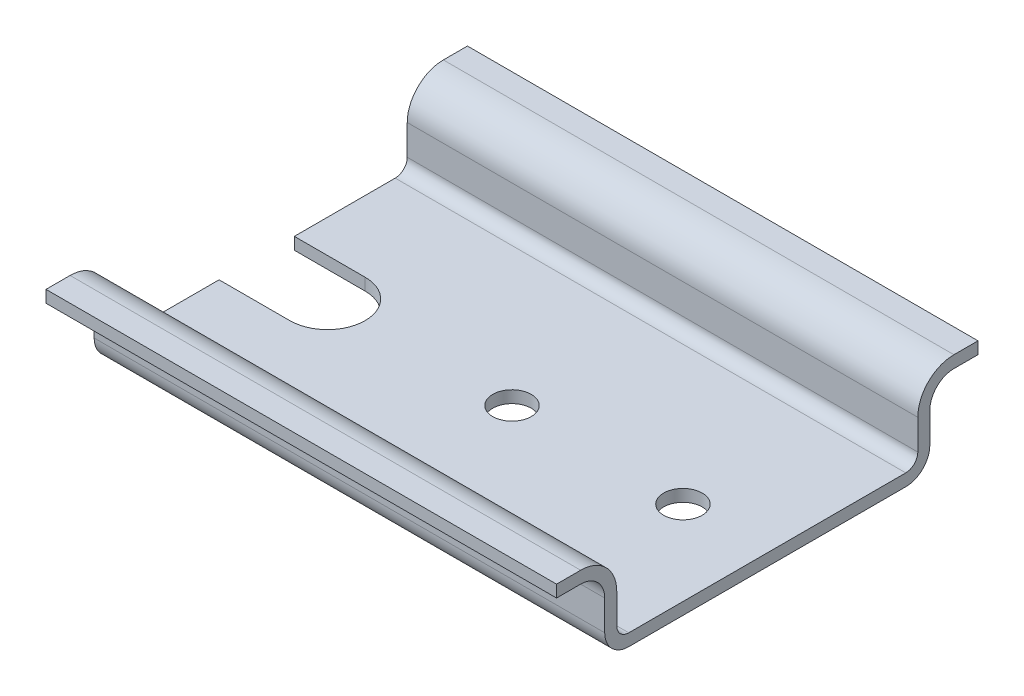
ISO-10303-21;
HEADER;
FILE_DESCRIPTION(('STEP AP214'),'2;1');
FILE_NAME('part.step','',(''),(''),'','','');
FILE_SCHEMA(('AUTOMOTIVE_DESIGN { 1 0 10303 214 1 1 1 1 }'));
ENDSEC;
DATA;
#1=APPLICATION_CONTEXT('core data for automotive mechanical design processes');
#2=APPLICATION_PROTOCOL_DEFINITION('international standard','automotive_design',2000,#1);
#3=PRODUCT_CONTEXT('',#1,'mechanical');
#4=PRODUCT('Part','Part','',(#3));
#5=PRODUCT_RELATED_PRODUCT_CATEGORY('part','',(#4));
#6=PRODUCT_DEFINITION_FORMATION('','',#4);
#7=PRODUCT_DEFINITION_CONTEXT('part definition',#1,'design');
#8=PRODUCT_DEFINITION('design','',#6,#7);
#9=PRODUCT_DEFINITION_SHAPE('','',#8);
#10=(LENGTH_UNIT() NAMED_UNIT(*) SI_UNIT(.MILLI.,.METRE.));
#11=(NAMED_UNIT(*) PLANE_ANGLE_UNIT() SI_UNIT($,.RADIAN.));
#12=(NAMED_UNIT(*) SI_UNIT($,.STERADIAN.) SOLID_ANGLE_UNIT());
#13=UNCERTAINTY_MEASURE_WITH_UNIT(LENGTH_MEASURE(1.E-05),#10,'distance_accuracy_value','');
#14=(GEOMETRIC_REPRESENTATION_CONTEXT(3) GLOBAL_UNCERTAINTY_ASSIGNED_CONTEXT((#13)) GLOBAL_UNIT_ASSIGNED_CONTEXT((#10,
#11,#12)) REPRESENTATION_CONTEXT('',''));
#15=CARTESIAN_POINT('',(0.,0.,0.));
#16=DIRECTION('',(0.,0.,1.));
#17=DIRECTION('',(1.,0.,0.));
#18=AXIS2_PLACEMENT_3D('',#15,#16,#17);
#19=CARTESIAN_POINT('',(0.,4.5,15.5));
#20=DIRECTION('',(1.,0.,0.));
#21=DIRECTION('',(0.,0.,-1.));
#22=AXIS2_PLACEMENT_3D('',#19,#20,#21);
#23=PLANE('',#22);
#24=DIRECTION('',(0.,0.,1.));
#25=VECTOR('',#24,1.);
#26=CARTESIAN_POINT('',(0.,0.,11.5));
#27=LINE('',#26,#25);
#28=CARTESIAN_POINT('',(0.,0.,-11.5));
#29=VERTEX_POINT('',#28);
#30=CARTESIAN_POINT('',(0.,0.,-3.125));
#31=VERTEX_POINT('',#30);
#32=EDGE_CURVE('E233',#29,#31,#27,.T.);
#33=ORIENTED_EDGE('',*,*,#32,.T.);
#34=DIRECTION('',(0.,-1.,0.));
#35=VECTOR('',#34,1.);
#36=CARTESIAN_POINT('',(0.,7.501,-3.125));
#37=LINE('',#36,#35);
#38=CARTESIAN_POINT('',(0.,1.,-3.125));
#39=VERTEX_POINT('',#38);
#40=EDGE_CURVE('E319',#39,#31,#37,.T.);
#41=ORIENTED_EDGE('',*,*,#40,.F.);
#42=DIRECTION('',(0.,0.,-1.));
#43=VECTOR('',#42,1.);
#44=CARTESIAN_POINT('',(0.,1.,11.5));
#45=LINE('',#44,#43);
#46=CARTESIAN_POINT('',(0.,1.,-11.5));
#47=VERTEX_POINT('',#46);
#48=EDGE_CURVE('E260',#47,#39,#45,.F.);
#49=ORIENTED_EDGE('',*,*,#48,.F.);
#50=CARTESIAN_POINT('',(0.,2.,-11.5));
#51=DIRECTION('',(1.,0.,0.));
#52=DIRECTION('',(0.,0.,-1.));
#53=AXIS2_PLACEMENT_3D('',#50,#51,#52);
#54=CIRCLE('',#53,0.999999999999999);
#55=CARTESIAN_POINT('',(0.,2.,-12.5));
#56=VERTEX_POINT('',#55);
#57=EDGE_CURVE('E257',#56,#47,#54,.F.);
#58=ORIENTED_EDGE('',*,*,#57,.F.);
#59=DIRECTION('',(0.,1.,0.));
#60=VECTOR('',#59,1.);
#61=CARTESIAN_POINT('',(0.,2.,-12.5));
#62=LINE('',#61,#60);
#63=CARTESIAN_POINT('',(0.,4.5,-12.5));
#64=VERTEX_POINT('',#63);
#65=EDGE_CURVE('E255',#64,#56,#62,.F.);
#66=ORIENTED_EDGE('',*,*,#65,.F.);
#67=CARTESIAN_POINT('',(0.,4.5,-15.5));
#68=DIRECTION('',(1.,0.,0.));
#69=DIRECTION('',(0.,0.,-1.));
#70=AXIS2_PLACEMENT_3D('',#67,#68,#69);
#71=CIRCLE('',#70,3.);
#72=CARTESIAN_POINT('',(0.,7.5,-15.5));
#73=VERTEX_POINT('',#72);
#74=EDGE_CURVE('E253',#73,#64,#71,.T.);
#75=ORIENTED_EDGE('',*,*,#74,.F.);
#76=DIRECTION('',(0.,0.,-1.));
#77=VECTOR('',#76,1.);
#78=CARTESIAN_POINT('',(0.,7.5,-15.5));
#79=LINE('',#78,#77);
#80=CARTESIAN_POINT('',(0.,7.5,-17.5));
#81=VERTEX_POINT('',#80);
#82=EDGE_CURVE('E251',#81,#73,#79,.F.);
#83=ORIENTED_EDGE('',*,*,#82,.F.);
#84=DIRECTION('',(0.,-1.,0.));
#85=VECTOR('',#84,1.);
#86=CARTESIAN_POINT('',(0.,7.5,-17.5));
#87=LINE('',#86,#85);
#88=CARTESIAN_POINT('',(0.,6.5,-17.5));
#89=VERTEX_POINT('',#88);
#90=EDGE_CURVE('E248',#81,#89,#87,.T.);
#91=ORIENTED_EDGE('',*,*,#90,.T.);
#92=DIRECTION('',(0.,0.,1.));
#93=VECTOR('',#92,1.);
#94=CARTESIAN_POINT('',(0.,6.5,-15.5));
#95=LINE('',#94,#93);
#96=CARTESIAN_POINT('',(0.,6.5,-15.5));
#97=VERTEX_POINT('',#96);
#98=EDGE_CURVE('E245',#89,#97,#95,.T.);
#99=ORIENTED_EDGE('',*,*,#98,.T.);
#100=CARTESIAN_POINT('',(0.,4.5,-15.5));
#101=DIRECTION('',(1.,0.,0.));
#102=DIRECTION('',(0.,0.,-1.));
#103=AXIS2_PLACEMENT_3D('',#100,#101,#102);
#104=CIRCLE('',#103,2.);
#105=CARTESIAN_POINT('',(0.,4.5,-13.5));
#106=VERTEX_POINT('',#105);
#107=EDGE_CURVE('E242',#97,#106,#104,.T.);
#108=ORIENTED_EDGE('',*,*,#107,.T.);
#109=DIRECTION('',(0.,-1.,0.));
#110=VECTOR('',#109,1.);
#111=CARTESIAN_POINT('',(0.,2.,-13.5));
#112=LINE('',#111,#110);
#113=CARTESIAN_POINT('',(0.,2.,-13.5));
#114=VERTEX_POINT('',#113);
#115=EDGE_CURVE('E239',#106,#114,#112,.T.);
#116=ORIENTED_EDGE('',*,*,#115,.T.);
#117=CARTESIAN_POINT('',(0.,2.,-11.5));
#118=DIRECTION('',(-1.,0.,0.));
#119=DIRECTION('',(0.,0.,1.));
#120=AXIS2_PLACEMENT_3D('',#117,#118,#119);
#121=CIRCLE('',#120,2.);
#122=EDGE_CURVE('E236',#114,#29,#121,.T.);
#123=ORIENTED_EDGE('',*,*,#122,.T.);
#124=EDGE_LOOP('',(#33,#41,#49,#58,#66,#75,#83,#91,#99,#108,#116,#123));
#125=FACE_BOUND('',#124,.T.);
#126=ADVANCED_FACE('F32',(#125),#23,.F.);
#127=CARTESIAN_POINT('',(42.4,7.5,15.5));
#128=DIRECTION('',(0.,-1.,0.));
#129=DIRECTION('',(0.,0.,-1.));
#130=AXIS2_PLACEMENT_3D('',#127,#128,#129);
#131=PLANE('',#130);
#132=DIRECTION('',(0.,0.,-1.));
#133=VECTOR('',#132,1.);
#134=CARTESIAN_POINT('',(0.,7.5,15.5));
#135=LINE('',#134,#133);
#136=CARTESIAN_POINT('',(0.,7.5,15.5));
#137=VERTEX_POINT('',#136);
#138=CARTESIAN_POINT('',(0.,7.5,17.5));
#139=VERTEX_POINT('',#138);
#140=EDGE_CURVE('E213',#137,#139,#135,.F.);
#141=ORIENTED_EDGE('',*,*,#140,.T.);
#142=DIRECTION('',(-1.,0.,0.));
#143=VECTOR('',#142,1.);
#144=CARTESIAN_POINT('',(42.4,7.5,17.5));
#145=LINE('',#144,#143);
#146=CARTESIAN_POINT('',(42.4,7.5,17.5));
#147=VERTEX_POINT('',#146);
#148=EDGE_CURVE('E11',#147,#139,#145,.T.);
#149=ORIENTED_EDGE('',*,*,#148,.F.);
#150=DIRECTION('',(0.,0.,-1.));
#151=VECTOR('',#150,1.);
#152=CARTESIAN_POINT('',(42.4,7.5,15.5));
#153=LINE('',#152,#151);
#154=CARTESIAN_POINT('',(42.4,7.5,15.5));
#155=VERTEX_POINT('',#154);
#156=EDGE_CURVE('E132',#155,#147,#153,.F.);
#157=ORIENTED_EDGE('',*,*,#156,.F.);
#158=DIRECTION('',(-1.,0.,0.));
#159=VECTOR('',#158,1.);
#160=CARTESIAN_POINT('',(42.4,7.5,15.5));
#161=LINE('',#160,#159);
#162=EDGE_CURVE('E209',#155,#137,#161,.T.);
#163=ORIENTED_EDGE('',*,*,#162,.T.);
#164=EDGE_LOOP('',(#141,#149,#157,#163));
#165=FACE_BOUND('',#164,.T.);
#166=ADVANCED_FACE('F34',(#165),#131,.F.);
#167=CARTESIAN_POINT('',(42.4,6.5,17.5));
#168=DIRECTION('',(0.,0.,1.));
#169=DIRECTION('',(1.,0.,0.));
#170=AXIS2_PLACEMENT_3D('',#167,#168,#169);
#171=PLANE('',#170);
#172=DIRECTION('',(0.,1.,0.));
#173=VECTOR('',#172,1.);
#174=CARTESIAN_POINT('',(0.,6.5,17.5));
#175=LINE('',#174,#173);
#176=CARTESIAN_POINT('',(0.,6.5,17.5));
#177=VERTEX_POINT('',#176);
#178=EDGE_CURVE('E216',#177,#139,#175,.T.);
#179=ORIENTED_EDGE('',*,*,#178,.F.);
#180=DIRECTION('',(-1.,0.,0.));
#181=VECTOR('',#180,1.);
#182=CARTESIAN_POINT('',(42.4,6.5,17.5));
#183=LINE('',#182,#181);
#184=CARTESIAN_POINT('',(42.4,6.5,17.5));
#185=VERTEX_POINT('',#184);
#186=EDGE_CURVE('E41',#185,#177,#183,.T.);
#187=ORIENTED_EDGE('',*,*,#186,.F.);
#188=DIRECTION('',(0.,1.,0.));
#189=VECTOR('',#188,1.);
#190=CARTESIAN_POINT('',(42.4,6.5,17.5));
#191=LINE('',#190,#189);
#192=EDGE_CURVE('E343',#185,#147,#191,.T.);
#193=ORIENTED_EDGE('',*,*,#192,.T.);
#194=ORIENTED_EDGE('',*,*,#148,.T.);
#195=EDGE_LOOP('',(#179,#187,#193,#194));
#196=FACE_BOUND('',#195,.T.);
#197=ADVANCED_FACE('F403',(#196),#171,.T.);
#198=CARTESIAN_POINT('',(42.4,6.5,15.5));
#199=DIRECTION('',(0.,-1.,0.));
#200=DIRECTION('',(0.,0.,-1.));
#201=AXIS2_PLACEMENT_3D('',#198,#199,#200);
#202=PLANE('',#201);
#203=DIRECTION('',(0.,0.,1.));
#204=VECTOR('',#203,1.);
#205=CARTESIAN_POINT('',(0.,6.5,15.5));
#206=LINE('',#205,#204);
#207=CARTESIAN_POINT('',(0.,6.5,15.5));
#208=VERTEX_POINT('',#207);
#209=EDGE_CURVE('E220',#208,#177,#206,.T.);
#210=ORIENTED_EDGE('',*,*,#209,.F.);
#211=DIRECTION('',(-1.,0.,0.));
#212=VECTOR('',#211,1.);
#213=CARTESIAN_POINT('',(42.4,6.5,15.5));
#214=LINE('',#213,#212);
#215=CARTESIAN_POINT('',(42.4,6.5,15.5));
#216=VERTEX_POINT('',#215);
#217=EDGE_CURVE('E301',#216,#208,#214,.T.);
#218=ORIENTED_EDGE('',*,*,#217,.F.);
#219=DIRECTION('',(0.,0.,1.));
#220=VECTOR('',#219,1.);
#221=CARTESIAN_POINT('',(42.4,6.5,15.5));
#222=LINE('',#221,#220);
#223=EDGE_CURVE('E346',#216,#185,#222,.T.);
#224=ORIENTED_EDGE('',*,*,#223,.T.);
#225=ORIENTED_EDGE('',*,*,#186,.T.);
#226=EDGE_LOOP('',(#210,#218,#224,#225));
#227=FACE_BOUND('',#226,.T.);
#228=ADVANCED_FACE('F408',(#227),#202,.T.);
#229=CARTESIAN_POINT('',(42.4,4.5,15.5));
#230=DIRECTION('',(-1.,0.,0.));
#231=DIRECTION('',(0.,0.,1.));
#232=AXIS2_PLACEMENT_3D('',#229,#230,#231);
#233=CYLINDRICAL_SURFACE('',#232,2.);
#234=CARTESIAN_POINT('',(0.,4.5,15.5));
#235=DIRECTION('',(1.,0.,0.));
#236=DIRECTION('',(0.,0.,1.));
#237=AXIS2_PLACEMENT_3D('',#234,#235,#236);
#238=CIRCLE('',#237,2.);
#239=CARTESIAN_POINT('',(0.,4.5,13.5));
#240=VERTEX_POINT('',#239);
#241=EDGE_CURVE('E223',#240,#208,#238,.T.);
#242=ORIENTED_EDGE('',*,*,#241,.F.);
#243=DIRECTION('',(-1.,0.,0.));
#244=VECTOR('',#243,1.);
#245=CARTESIAN_POINT('',(42.4,4.5,13.5));
#246=LINE('',#245,#244);
#247=CARTESIAN_POINT('',(42.4,4.5,13.5));
#248=VERTEX_POINT('',#247);
#249=EDGE_CURVE('E299',#248,#240,#246,.T.);
#250=ORIENTED_EDGE('',*,*,#249,.F.);
#251=CARTESIAN_POINT('',(42.4,4.5,15.5));
#252=DIRECTION('',(1.,0.,0.));
#253=DIRECTION('',(0.,0.,1.));
#254=AXIS2_PLACEMENT_3D('',#251,#252,#253);
#255=CIRCLE('',#254,2.);
#256=EDGE_CURVE('E349',#248,#216,#255,.T.);
#257=ORIENTED_EDGE('',*,*,#256,.T.);
#258=ORIENTED_EDGE('',*,*,#217,.T.);
#259=EDGE_LOOP('',(#242,#250,#257,#258));
#260=FACE_BOUND('',#259,.T.);
#261=ADVANCED_FACE('F411',(#260),#233,.F.);
#262=CARTESIAN_POINT('',(42.4,2.,13.5));
#263=DIRECTION('',(0.,0.,1.));
#264=DIRECTION('',(1.,0.,0.));
#265=AXIS2_PLACEMENT_3D('',#262,#263,#264);
#266=PLANE('',#265);
#267=DIRECTION('',(0.,1.,0.));
#268=VECTOR('',#267,1.);
#269=CARTESIAN_POINT('',(0.,2.,13.5));
#270=LINE('',#269,#268);
#271=CARTESIAN_POINT('',(0.,2.,13.5));
#272=VERTEX_POINT('',#271);
#273=EDGE_CURVE('E226',#272,#240,#270,.T.);
#274=ORIENTED_EDGE('',*,*,#273,.F.);
#275=DIRECTION('',(-1.,0.,0.));
#276=VECTOR('',#275,1.);
#277=CARTESIAN_POINT('',(42.4,2.,13.5));
#278=LINE('',#277,#276);
#279=CARTESIAN_POINT('',(42.4,2.,13.5));
#280=VERTEX_POINT('',#279);
#281=EDGE_CURVE('E297',#280,#272,#278,.T.);
#282=ORIENTED_EDGE('',*,*,#281,.F.);
#283=DIRECTION('',(0.,1.,0.));
#284=VECTOR('',#283,1.);
#285=CARTESIAN_POINT('',(42.4,2.,13.5));
#286=LINE('',#285,#284);
#287=EDGE_CURVE('E352',#280,#248,#286,.T.);
#288=ORIENTED_EDGE('',*,*,#287,.T.);
#289=ORIENTED_EDGE('',*,*,#249,.T.);
#290=EDGE_LOOP('',(#274,#282,#288,#289));
#291=FACE_BOUND('',#290,.T.);
#292=ADVANCED_FACE('F416',(#291),#266,.T.);
#293=CARTESIAN_POINT('',(42.4,2.,11.5));
#294=DIRECTION('',(-1.,0.,0.));
#295=DIRECTION('',(0.,0.,1.));
#296=AXIS2_PLACEMENT_3D('',#293,#294,#295);
#297=CYLINDRICAL_SURFACE('',#296,2.);
#298=CARTESIAN_POINT('',(0.,2.,11.5));
#299=DIRECTION('',(-1.,0.,0.));
#300=DIRECTION('',(0.,0.,-1.));
#301=AXIS2_PLACEMENT_3D('',#298,#299,#300);
#302=CIRCLE('',#301,2.);
#303=CARTESIAN_POINT('',(0.,0.,11.5));
#304=VERTEX_POINT('',#303);
#305=EDGE_CURVE('E229',#304,#272,#302,.T.);
#306=ORIENTED_EDGE('',*,*,#305,.F.);
#307=DIRECTION('',(-1.,0.,0.));
#308=VECTOR('',#307,1.);
#309=CARTESIAN_POINT('',(42.4,0.,11.5));
#310=LINE('',#309,#308);
#311=CARTESIAN_POINT('',(42.4,0.,11.5));
#312=VERTEX_POINT('',#311);
#313=EDGE_CURVE('E294',#312,#304,#310,.T.);
#314=ORIENTED_EDGE('',*,*,#313,.F.);
#315=CARTESIAN_POINT('',(42.4,2.,11.5));
#316=DIRECTION('',(-1.,0.,0.));
#317=DIRECTION('',(0.,0.,-1.));
#318=AXIS2_PLACEMENT_3D('',#315,#316,#317);
#319=CIRCLE('',#318,2.);
#320=EDGE_CURVE('E355',#312,#280,#319,.T.);
#321=ORIENTED_EDGE('',*,*,#320,.T.);
#322=ORIENTED_EDGE('',*,*,#281,.T.);
#323=EDGE_LOOP('',(#306,#314,#321,#322));
#324=FACE_BOUND('',#323,.T.);
#325=ADVANCED_FACE('F419',(#324),#297,.T.);
#326=CARTESIAN_POINT('',(42.4,0.,11.5));
#327=DIRECTION('',(0.,-1.,0.));
#328=DIRECTION('',(0.,0.,-1.));
#329=AXIS2_PLACEMENT_3D('',#326,#327,#328);
#330=PLANE('',#329);
#331=CARTESIAN_POINT('',(35.3964846059363,0.,-1.94289029309402E-13));
#332=DIRECTION('',(0.,-1.,0.));
#333=DIRECTION('',(0.,0.,-1.));
#334=AXIS2_PLACEMENT_3D('',#331,#332,#333);
#335=CIRCLE('',#334,1.59999999999999);
#336=CARTESIAN_POINT('',(35.3964846059363,0.,-1.60000000000019));
#337=VERTEX_POINT('',#336);
#338=EDGE_CURVE('E305',#337,#337,#335,.T.);
#339=ORIENTED_EDGE('',*,*,#338,.F.);
#340=EDGE_LOOP('',(#339));
#341=FACE_BOUND('',#340,.T.);
#342=CARTESIAN_POINT('',(21.1999999999999,0.,-1.94289029309402E-13));
#343=DIRECTION('',(0.,-1.,0.));
#344=DIRECTION('',(0.,0.,-1.));
#345=AXIS2_PLACEMENT_3D('',#342,#343,#344);
#346=CIRCLE('',#345,1.59999999999999);
#347=CARTESIAN_POINT('',(21.1999999999999,0.,-1.60000000000019));
#348=VERTEX_POINT('',#347);
#349=EDGE_CURVE('E311',#348,#348,#346,.T.);
#350=ORIENTED_EDGE('',*,*,#349,.F.);
#351=EDGE_LOOP('',(#350));
#352=FACE_BOUND('',#351,.T.);
#353=DIRECTION('',(1.,0.,0.));
#354=VECTOR('',#353,1.);
#355=CARTESIAN_POINT('',(-5.875,0.,-3.125));
#356=LINE('',#355,#354);
#357=CARTESIAN_POINT('',(5.875,0.,-3.125));
#358=VERTEX_POINT('',#357);
#359=EDGE_CURVE('E332',#31,#358,#356,.T.);
#360=ORIENTED_EDGE('',*,*,#359,.F.);
#361=ORIENTED_EDGE('',*,*,#32,.F.);
#362=DIRECTION('',(-1.,0.,0.));
#363=VECTOR('',#362,1.);
#364=CARTESIAN_POINT('',(42.4,0.,-11.5));
#365=LINE('',#364,#363);
#366=CARTESIAN_POINT('',(42.4,0.,-11.5));
#367=VERTEX_POINT('',#366);
#368=EDGE_CURVE('E292',#367,#29,#365,.T.);
#369=ORIENTED_EDGE('',*,*,#368,.F.);
#370=DIRECTION('',(0.,0.,1.));
#371=VECTOR('',#370,1.);
#372=CARTESIAN_POINT('',(42.4,0.,11.5));
#373=LINE('',#372,#371);
#374=EDGE_CURVE('E358',#367,#312,#373,.T.);
#375=ORIENTED_EDGE('',*,*,#374,.T.);
#376=ORIENTED_EDGE('',*,*,#313,.T.);
#377=CARTESIAN_POINT('',(0.,0.,3.125));
#378=VERTEX_POINT('',#377);
#379=EDGE_CURVE('E232',#378,#304,#27,.T.);
#380=ORIENTED_EDGE('',*,*,#379,.F.);
#381=DIRECTION('',(-1.,0.,0.));
#382=VECTOR('',#381,1.);
#383=CARTESIAN_POINT('',(-5.875,0.,3.125));
#384=LINE('',#383,#382);
#385=CARTESIAN_POINT('',(5.875,0.,3.125));
#386=VERTEX_POINT('',#385);
#387=EDGE_CURVE('E49',#386,#378,#384,.T.);
#388=ORIENTED_EDGE('',*,*,#387,.F.);
#389=CARTESIAN_POINT('',(5.875,0.,0.));
#390=DIRECTION('',(0.,-1.,0.));
#391=DIRECTION('',(0.,0.,1.));
#392=AXIS2_PLACEMENT_3D('',#389,#390,#391);
#393=CIRCLE('',#392,3.125);
#394=EDGE_CURVE('E328',#358,#386,#393,.T.);
#395=ORIENTED_EDGE('',*,*,#394,.F.);
#396=EDGE_LOOP('',(#360,#361,#369,#375,#376,#380,#388,#395));
#397=FACE_BOUND('',#396,.T.);
#398=ADVANCED_FACE('F424',(#341,#352,#397),#330,.T.);
#399=CARTESIAN_POINT('',(42.4,2.,-11.5));
#400=DIRECTION('',(-1.,0.,0.));
#401=DIRECTION('',(0.,0.,1.));
#402=AXIS2_PLACEMENT_3D('',#399,#400,#401);
#403=CYLINDRICAL_SURFACE('',#402,2.);
#404=ORIENTED_EDGE('',*,*,#122,.F.);
#405=DIRECTION('',(-1.,0.,0.));
#406=VECTOR('',#405,1.);
#407=CARTESIAN_POINT('',(42.4,2.,-13.5));
#408=LINE('',#407,#406);
#409=CARTESIAN_POINT('',(42.4,2.,-13.5));
#410=VERTEX_POINT('',#409);
#411=EDGE_CURVE('E290',#410,#114,#408,.T.);
#412=ORIENTED_EDGE('',*,*,#411,.F.);
#413=CARTESIAN_POINT('',(42.4,2.,-11.5));
#414=DIRECTION('',(-1.,0.,0.));
#415=DIRECTION('',(0.,0.,1.));
#416=AXIS2_PLACEMENT_3D('',#413,#414,#415);
#417=CIRCLE('',#416,2.);
#418=EDGE_CURVE('E361',#410,#367,#417,.T.);
#419=ORIENTED_EDGE('',*,*,#418,.T.);
#420=ORIENTED_EDGE('',*,*,#368,.T.);
#421=EDGE_LOOP('',(#404,#412,#419,#420));
#422=FACE_BOUND('',#421,.T.);
#423=ADVANCED_FACE('F429',(#422),#403,.T.);
#424=CARTESIAN_POINT('',(42.4,2.,-13.5));
#425=DIRECTION('',(0.,0.,-1.));
#426=DIRECTION('',(-1.,0.,0.));
#427=AXIS2_PLACEMENT_3D('',#424,#425,#426);
#428=PLANE('',#427);
#429=ORIENTED_EDGE('',*,*,#115,.F.);
#430=DIRECTION('',(-1.,0.,0.));
#431=VECTOR('',#430,1.);
#432=CARTESIAN_POINT('',(42.4,4.5,-13.5));
#433=LINE('',#432,#431);
#434=CARTESIAN_POINT('',(42.4,4.5,-13.5));
#435=VERTEX_POINT('',#434);
#436=EDGE_CURVE('E288',#435,#106,#433,.T.);
#437=ORIENTED_EDGE('',*,*,#436,.F.);
#438=DIRECTION('',(0.,-1.,0.));
#439=VECTOR('',#438,1.);
#440=CARTESIAN_POINT('',(42.4,2.,-13.5));
#441=LINE('',#440,#439);
#442=EDGE_CURVE('E364',#435,#410,#441,.T.);
#443=ORIENTED_EDGE('',*,*,#442,.T.);
#444=ORIENTED_EDGE('',*,*,#411,.T.);
#445=EDGE_LOOP('',(#429,#437,#443,#444));
#446=FACE_BOUND('',#445,.T.);
#447=ADVANCED_FACE('F434',(#446),#428,.T.);
#448=CARTESIAN_POINT('',(42.4,4.5,-15.5));
#449=DIRECTION('',(-1.,0.,0.));
#450=DIRECTION('',(0.,0.,1.));
#451=AXIS2_PLACEMENT_3D('',#448,#449,#450);
#452=CYLINDRICAL_SURFACE('',#451,2.);
#453=ORIENTED_EDGE('',*,*,#107,.F.);
#454=DIRECTION('',(-1.,0.,0.));
#455=VECTOR('',#454,1.);
#456=CARTESIAN_POINT('',(42.4,6.5,-15.5));
#457=LINE('',#456,#455);
#458=CARTESIAN_POINT('',(42.4,6.5,-15.5));
#459=VERTEX_POINT('',#458);
#460=EDGE_CURVE('E286',#459,#97,#457,.T.);
#461=ORIENTED_EDGE('',*,*,#460,.F.);
#462=CARTESIAN_POINT('',(42.4,4.5,-15.5));
#463=DIRECTION('',(1.,0.,0.));
#464=DIRECTION('',(0.,0.,-1.));
#465=AXIS2_PLACEMENT_3D('',#462,#463,#464);
#466=CIRCLE('',#465,2.);
#467=EDGE_CURVE('E367',#459,#435,#466,.T.);
#468=ORIENTED_EDGE('',*,*,#467,.T.);
#469=ORIENTED_EDGE('',*,*,#436,.T.);
#470=EDGE_LOOP('',(#453,#461,#468,#469));
#471=FACE_BOUND('',#470,.T.);
#472=ADVANCED_FACE('F437',(#471),#452,.F.);
#473=CARTESIAN_POINT('',(42.4,6.5,-15.5));
#474=DIRECTION('',(0.,-1.,0.));
#475=DIRECTION('',(0.,0.,-1.));
#476=AXIS2_PLACEMENT_3D('',#473,#474,#475);
#477=PLANE('',#476);
#478=ORIENTED_EDGE('',*,*,#98,.F.);
#479=DIRECTION('',(-1.,0.,0.));
#480=VECTOR('',#479,1.);
#481=CARTESIAN_POINT('',(42.4,6.5,-17.5));
#482=LINE('',#481,#480);
#483=CARTESIAN_POINT('',(42.4,6.5,-17.5));
#484=VERTEX_POINT('',#483);
#485=EDGE_CURVE('E284',#484,#89,#482,.T.);
#486=ORIENTED_EDGE('',*,*,#485,.F.);
#487=DIRECTION('',(0.,0.,1.));
#488=VECTOR('',#487,1.);
#489=CARTESIAN_POINT('',(42.4,6.5,-15.5));
#490=LINE('',#489,#488);
#491=EDGE_CURVE('E370',#484,#459,#490,.T.);
#492=ORIENTED_EDGE('',*,*,#491,.T.);
#493=ORIENTED_EDGE('',*,*,#460,.T.);
#494=EDGE_LOOP('',(#478,#486,#492,#493));
#495=FACE_BOUND('',#494,.T.);
#496=ADVANCED_FACE('F442',(#495),#477,.T.);
#497=CARTESIAN_POINT('',(42.4,7.5,-17.5));
#498=DIRECTION('',(0.,0.,-1.));
#499=DIRECTION('',(-1.,0.,0.));
#500=AXIS2_PLACEMENT_3D('',#497,#498,#499);
#501=PLANE('',#500);
#502=ORIENTED_EDGE('',*,*,#90,.F.);
#503=DIRECTION('',(-1.,0.,0.));
#504=VECTOR('',#503,1.);
#505=CARTESIAN_POINT('',(42.4,7.5,-17.5));
#506=LINE('',#505,#504);
#507=CARTESIAN_POINT('',(42.4,7.5,-17.5));
#508=VERTEX_POINT('',#507);
#509=EDGE_CURVE('E282',#508,#81,#506,.T.);
#510=ORIENTED_EDGE('',*,*,#509,.F.);
#511=DIRECTION('',(0.,-1.,0.));
#512=VECTOR('',#511,1.);
#513=CARTESIAN_POINT('',(42.4,7.5,-17.5));
#514=LINE('',#513,#512);
#515=EDGE_CURVE('E373',#508,#484,#514,.T.);
#516=ORIENTED_EDGE('',*,*,#515,.T.);
#517=ORIENTED_EDGE('',*,*,#485,.T.);
#518=EDGE_LOOP('',(#502,#510,#516,#517));
#519=FACE_BOUND('',#518,.T.);
#520=ADVANCED_FACE('F445',(#519),#501,.T.);
#521=CARTESIAN_POINT('',(42.4,7.5,-15.5));
#522=DIRECTION('',(0.,-1.,0.));
#523=DIRECTION('',(0.,0.,-1.));
#524=AXIS2_PLACEMENT_3D('',#521,#522,#523);
#525=PLANE('',#524);
#526=ORIENTED_EDGE('',*,*,#82,.T.);
#527=DIRECTION('',(-1.,0.,0.));
#528=VECTOR('',#527,1.);
#529=CARTESIAN_POINT('',(42.4,7.5,-15.5));
#530=LINE('',#529,#528);
#531=CARTESIAN_POINT('',(42.4,7.5,-15.5));
#532=VERTEX_POINT('',#531);
#533=EDGE_CURVE('E279',#532,#73,#530,.T.);
#534=ORIENTED_EDGE('',*,*,#533,.F.);
#535=DIRECTION('',(0.,0.,-1.));
#536=VECTOR('',#535,1.);
#537=CARTESIAN_POINT('',(42.4,7.5,-15.5));
#538=LINE('',#537,#536);
#539=EDGE_CURVE('E376',#508,#532,#538,.F.);
#540=ORIENTED_EDGE('',*,*,#539,.F.);
#541=ORIENTED_EDGE('',*,*,#509,.T.);
#542=EDGE_LOOP('',(#526,#534,#540,#541));
#543=FACE_BOUND('',#542,.T.);
#544=ADVANCED_FACE('F451',(#543),#525,.F.);
#545=CARTESIAN_POINT('',(42.4,4.5,-15.5));
#546=DIRECTION('',(-1.,0.,0.));
#547=DIRECTION('',(0.,0.,1.));
#548=AXIS2_PLACEMENT_3D('',#545,#546,#547);
#549=CYLINDRICAL_SURFACE('',#548,3.);
#550=ORIENTED_EDGE('',*,*,#74,.T.);
#551=DIRECTION('',(-1.,0.,0.));
#552=VECTOR('',#551,1.);
#553=CARTESIAN_POINT('',(42.4,4.5,-12.5));
#554=LINE('',#553,#552);
#555=CARTESIAN_POINT('',(42.4,4.5,-12.5));
#556=VERTEX_POINT('',#555);
#557=EDGE_CURVE('E276',#556,#64,#554,.T.);
#558=ORIENTED_EDGE('',*,*,#557,.F.);
#559=CARTESIAN_POINT('',(42.4,4.5,-15.5));
#560=DIRECTION('',(1.,0.,0.));
#561=DIRECTION('',(0.,0.,-1.));
#562=AXIS2_PLACEMENT_3D('',#559,#560,#561);
#563=CIRCLE('',#562,3.);
#564=EDGE_CURVE('E378',#532,#556,#563,.T.);
#565=ORIENTED_EDGE('',*,*,#564,.F.);
#566=ORIENTED_EDGE('',*,*,#533,.T.);
#567=EDGE_LOOP('',(#550,#558,#565,#566));
#568=FACE_BOUND('',#567,.T.);
#569=ADVANCED_FACE('F455',(#568),#549,.T.);
#570=CARTESIAN_POINT('',(42.4,2.,-12.5));
#571=DIRECTION('',(0.,0.,-1.));
#572=DIRECTION('',(-1.,0.,0.));
#573=AXIS2_PLACEMENT_3D('',#570,#571,#572);
#574=PLANE('',#573);
#575=ORIENTED_EDGE('',*,*,#65,.T.);
#576=DIRECTION('',(-1.,0.,0.));
#577=VECTOR('',#576,1.);
#578=CARTESIAN_POINT('',(42.4,2.,-12.5));
#579=LINE('',#578,#577);
#580=CARTESIAN_POINT('',(42.4,2.,-12.5));
#581=VERTEX_POINT('',#580);
#582=EDGE_CURVE('E273',#581,#56,#579,.T.);
#583=ORIENTED_EDGE('',*,*,#582,.F.);
#584=DIRECTION('',(0.,1.,0.));
#585=VECTOR('',#584,1.);
#586=CARTESIAN_POINT('',(42.4,2.,-12.5));
#587=LINE('',#586,#585);
#588=EDGE_CURVE('E380',#556,#581,#587,.F.);
#589=ORIENTED_EDGE('',*,*,#588,.F.);
#590=ORIENTED_EDGE('',*,*,#557,.T.);
#591=EDGE_LOOP('',(#575,#583,#589,#590));
#592=FACE_BOUND('',#591,.T.);
#593=ADVANCED_FACE('F458',(#592),#574,.F.);
#594=CARTESIAN_POINT('',(42.4,2.,-11.5));
#595=DIRECTION('',(-1.,0.,0.));
#596=DIRECTION('',(0.,0.,1.));
#597=AXIS2_PLACEMENT_3D('',#594,#595,#596);
#598=CYLINDRICAL_SURFACE('',#597,0.999999999999999);
#599=ORIENTED_EDGE('',*,*,#57,.T.);
#600=DIRECTION('',(-1.,0.,0.));
#601=VECTOR('',#600,1.);
#602=CARTESIAN_POINT('',(42.4,1.,-11.5));
#603=LINE('',#602,#601);
#604=CARTESIAN_POINT('',(42.4,1.,-11.5));
#605=VERTEX_POINT('',#604);
#606=EDGE_CURVE('E270',#605,#47,#603,.T.);
#607=ORIENTED_EDGE('',*,*,#606,.F.);
#608=CARTESIAN_POINT('',(42.4,2.,-11.5));
#609=DIRECTION('',(1.,0.,0.));
#610=DIRECTION('',(0.,0.,-1.));
#611=AXIS2_PLACEMENT_3D('',#608,#609,#610);
#612=CIRCLE('',#611,0.999999999999999);
#613=EDGE_CURVE('E382',#581,#605,#612,.F.);
#614=ORIENTED_EDGE('',*,*,#613,.F.);
#615=ORIENTED_EDGE('',*,*,#582,.T.);
#616=EDGE_LOOP('',(#599,#607,#614,#615));
#617=FACE_BOUND('',#616,.T.);
#618=ADVANCED_FACE('F388',(#617),#598,.F.);
#619=CARTESIAN_POINT('',(42.4,1.,11.5));
#620=DIRECTION('',(0.,-1.,0.));
#621=DIRECTION('',(0.,0.,-1.));
#622=AXIS2_PLACEMENT_3D('',#619,#620,#621);
#623=PLANE('',#622);
#624=CARTESIAN_POINT('',(35.3964846059363,1.,-1.94289029309402E-13));
#625=DIRECTION('',(0.,-1.,0.));
#626=DIRECTION('',(0.,0.,-1.));
#627=AXIS2_PLACEMENT_3D('',#624,#625,#626);
#628=CIRCLE('',#627,1.59999999999999);
#629=CARTESIAN_POINT('',(35.3964846059363,1.,-1.60000000000019));
#630=VERTEX_POINT('',#629);
#631=EDGE_CURVE('E36',#630,#630,#628,.T.);
#632=ORIENTED_EDGE('',*,*,#631,.T.);
#633=EDGE_LOOP('',(#632));
#634=FACE_BOUND('',#633,.T.);
#635=CARTESIAN_POINT('',(21.1999999999999,1.,-1.94289029309402E-13));
#636=DIRECTION('',(0.,-1.,0.));
#637=DIRECTION('',(0.,0.,-1.));
#638=AXIS2_PLACEMENT_3D('',#635,#636,#637);
#639=CIRCLE('',#638,1.59999999999999);
#640=CARTESIAN_POINT('',(21.1999999999999,1.,-1.60000000000019));
#641=VERTEX_POINT('',#640);
#642=EDGE_CURVE('E303',#641,#641,#639,.T.);
#643=ORIENTED_EDGE('',*,*,#642,.T.);
#644=EDGE_LOOP('',(#643));
#645=FACE_BOUND('',#644,.T.);
#646=ORIENTED_EDGE('',*,*,#48,.T.);
#647=DIRECTION('',(-1.,0.,0.));
#648=VECTOR('',#647,1.);
#649=CARTESIAN_POINT('',(-5.875,0.999999999999999,-3.125));
#650=LINE('',#649,#648);
#651=CARTESIAN_POINT('',(5.875,0.999999999999999,-3.125));
#652=VERTEX_POINT('',#651);
#653=EDGE_CURVE('E325',#652,#39,#650,.T.);
#654=ORIENTED_EDGE('',*,*,#653,.F.);
#655=CARTESIAN_POINT('',(5.875,0.999999999999999,0.));
#656=DIRECTION('',(0.,-1.,0.));
#657=DIRECTION('',(0.,0.,-1.));
#658=AXIS2_PLACEMENT_3D('',#655,#656,#657);
#659=CIRCLE('',#658,3.125);
#660=CARTESIAN_POINT('',(5.875,0.999999999999999,3.125));
#661=VERTEX_POINT('',#660);
#662=EDGE_CURVE('E322',#661,#652,#659,.F.);
#663=ORIENTED_EDGE('',*,*,#662,.F.);
#664=DIRECTION('',(1.,0.,0.));
#665=VECTOR('',#664,1.);
#666=CARTESIAN_POINT('',(-5.875,0.999999999999999,3.125));
#667=LINE('',#666,#665);
#668=CARTESIAN_POINT('',(0.,1.,3.125));
#669=VERTEX_POINT('',#668);
#670=EDGE_CURVE('E217',#669,#661,#667,.T.);
#671=ORIENTED_EDGE('',*,*,#670,.F.);
#672=CARTESIAN_POINT('',(0.,1.,11.5));
#673=VERTEX_POINT('',#672);
#674=EDGE_CURVE('E259',#669,#673,#45,.F.);
#675=ORIENTED_EDGE('',*,*,#674,.T.);
#676=DIRECTION('',(-1.,0.,0.));
#677=VECTOR('',#676,1.);
#678=CARTESIAN_POINT('',(42.4,1.,11.5));
#679=LINE('',#678,#677);
#680=CARTESIAN_POINT('',(42.4,1.,11.5));
#681=VERTEX_POINT('',#680);
#682=EDGE_CURVE('E204',#681,#673,#679,.T.);
#683=ORIENTED_EDGE('',*,*,#682,.F.);
#684=DIRECTION('',(0.,0.,-1.));
#685=VECTOR('',#684,1.);
#686=CARTESIAN_POINT('',(42.4,1.,11.5));
#687=LINE('',#686,#685);
#688=EDGE_CURVE('E192',#605,#681,#687,.F.);
#689=ORIENTED_EDGE('',*,*,#688,.F.);
#690=ORIENTED_EDGE('',*,*,#606,.T.);
#691=EDGE_LOOP('',(#646,#654,#663,#671,#675,#683,#689,#690));
#692=FACE_BOUND('',#691,.T.);
#693=ADVANCED_FACE('F392',(#634,#645,#692),#623,.F.);
#694=CARTESIAN_POINT('',(42.4,2.,11.5));
#695=DIRECTION('',(-1.,0.,0.));
#696=DIRECTION('',(0.,0.,1.));
#697=AXIS2_PLACEMENT_3D('',#694,#695,#696);
#698=CYLINDRICAL_SURFACE('',#697,0.999999999999999);
#699=CARTESIAN_POINT('',(0.,2.,11.5));
#700=DIRECTION('',(1.,0.,0.));
#701=DIRECTION('',(0.,0.,-1.));
#702=AXIS2_PLACEMENT_3D('',#699,#700,#701);
#703=CIRCLE('',#702,0.999999999999999);
#704=CARTESIAN_POINT('',(0.,2.,12.5));
#705=VERTEX_POINT('',#704);
#706=EDGE_CURVE('E201',#673,#705,#703,.F.);
#707=ORIENTED_EDGE('',*,*,#706,.T.);
#708=DIRECTION('',(-1.,0.,0.));
#709=VECTOR('',#708,1.);
#710=CARTESIAN_POINT('',(42.4,2.,12.5));
#711=LINE('',#710,#709);
#712=CARTESIAN_POINT('',(42.4,2.,12.5));
#713=VERTEX_POINT('',#712);
#714=EDGE_CURVE('E198',#713,#705,#711,.T.);
#715=ORIENTED_EDGE('',*,*,#714,.F.);
#716=CARTESIAN_POINT('',(42.4,2.,11.5));
#717=DIRECTION('',(1.,0.,0.));
#718=DIRECTION('',(0.,0.,-1.));
#719=AXIS2_PLACEMENT_3D('',#716,#717,#718);
#720=CIRCLE('',#719,0.999999999999999);
#721=EDGE_CURVE('E185',#681,#713,#720,.F.);
#722=ORIENTED_EDGE('',*,*,#721,.F.);
#723=ORIENTED_EDGE('',*,*,#682,.T.);
#724=EDGE_LOOP('',(#707,#715,#722,#723));
#725=FACE_BOUND('',#724,.T.);
#726=ADVANCED_FACE('F199',(#725),#698,.F.);
#727=CARTESIAN_POINT('',(42.4,2.,12.5));
#728=DIRECTION('',(0.,0.,1.));
#729=DIRECTION('',(1.,0.,0.));
#730=AXIS2_PLACEMENT_3D('',#727,#728,#729);
#731=PLANE('',#730);
#732=DIRECTION('',(0.,1.,0.));
#733=VECTOR('',#732,1.);
#734=CARTESIAN_POINT('',(0.,2.,12.5));
#735=LINE('',#734,#733);
#736=CARTESIAN_POINT('',(0.,4.5,12.5));
#737=VERTEX_POINT('',#736);
#738=EDGE_CURVE('E264',#705,#737,#735,.T.);
#739=ORIENTED_EDGE('',*,*,#738,.T.);
#740=DIRECTION('',(-1.,0.,0.));
#741=VECTOR('',#740,1.);
#742=CARTESIAN_POINT('',(42.4,4.5,12.5));
#743=LINE('',#742,#741);
#744=CARTESIAN_POINT('',(42.4,4.5,12.5));
#745=VERTEX_POINT('',#744);
#746=EDGE_CURVE('E205',#745,#737,#743,.T.);
#747=ORIENTED_EDGE('',*,*,#746,.F.);
#748=DIRECTION('',(0.,1.,0.));
#749=VECTOR('',#748,1.);
#750=CARTESIAN_POINT('',(42.4,2.,12.5));
#751=LINE('',#750,#749);
#752=EDGE_CURVE('E189',#713,#745,#751,.T.);
#753=ORIENTED_EDGE('',*,*,#752,.F.);
#754=ORIENTED_EDGE('',*,*,#714,.T.);
#755=EDGE_LOOP('',(#739,#747,#753,#754));
#756=FACE_BOUND('',#755,.T.);
#757=ADVANCED_FACE('F207',(#756),#731,.F.);
#758=CARTESIAN_POINT('',(42.4,4.5,15.5));
#759=DIRECTION('',(-1.,0.,0.));
#760=DIRECTION('',(0.,0.,1.));
#761=AXIS2_PLACEMENT_3D('',#758,#759,#760);
#762=CYLINDRICAL_SURFACE('',#761,3.);
#763=CARTESIAN_POINT('',(0.,4.5,15.5));
#764=DIRECTION('',(1.,0.,0.));
#765=DIRECTION('',(0.,0.,-1.));
#766=AXIS2_PLACEMENT_3D('',#763,#764,#765);
#767=CIRCLE('',#766,3.);
#768=EDGE_CURVE('E126',#737,#137,#767,.T.);
#769=ORIENTED_EDGE('',*,*,#768,.T.);
#770=ORIENTED_EDGE('',*,*,#162,.F.);
#771=CARTESIAN_POINT('',(42.4,4.5,15.5));
#772=DIRECTION('',(1.,0.,0.));
#773=DIRECTION('',(0.,0.,-1.));
#774=AXIS2_PLACEMENT_3D('',#771,#772,#773);
#775=CIRCLE('',#774,3.);
#776=EDGE_CURVE('E58',#745,#155,#775,.T.);
#777=ORIENTED_EDGE('',*,*,#776,.F.);
#778=ORIENTED_EDGE('',*,*,#746,.T.);
#779=EDGE_LOOP('',(#769,#770,#777,#778));
#780=FACE_BOUND('',#779,.T.);
#781=ADVANCED_FACE('F399',(#780),#762,.T.);
#782=CARTESIAN_POINT('',(42.4,4.5,15.5));
#783=DIRECTION('',(1.,0.,0.));
#784=DIRECTION('',(0.,0.,-1.));
#785=AXIS2_PLACEMENT_3D('',#782,#783,#784);
#786=PLANE('',#785);
#787=ORIENTED_EDGE('',*,*,#156,.T.);
#788=ORIENTED_EDGE('',*,*,#192,.F.);
#789=ORIENTED_EDGE('',*,*,#223,.F.);
#790=ORIENTED_EDGE('',*,*,#256,.F.);
#791=ORIENTED_EDGE('',*,*,#287,.F.);
#792=ORIENTED_EDGE('',*,*,#320,.F.);
#793=ORIENTED_EDGE('',*,*,#374,.F.);
#794=ORIENTED_EDGE('',*,*,#418,.F.);
#795=ORIENTED_EDGE('',*,*,#442,.F.);
#796=ORIENTED_EDGE('',*,*,#467,.F.);
#797=ORIENTED_EDGE('',*,*,#491,.F.);
#798=ORIENTED_EDGE('',*,*,#515,.F.);
#799=ORIENTED_EDGE('',*,*,#539,.T.);
#800=ORIENTED_EDGE('',*,*,#564,.T.);
#801=ORIENTED_EDGE('',*,*,#588,.T.);
#802=ORIENTED_EDGE('',*,*,#613,.T.);
#803=ORIENTED_EDGE('',*,*,#688,.T.);
#804=ORIENTED_EDGE('',*,*,#721,.T.);
#805=ORIENTED_EDGE('',*,*,#752,.T.);
#806=ORIENTED_EDGE('',*,*,#776,.T.);
#807=EDGE_LOOP('',(#787,#788,#789,#790,#791,#792,#793,#794,#795,#796,#797,#798,#799,#800,#801,
#802,#803,#804,#805,#806));
#808=FACE_BOUND('',#807,.T.);
#809=ADVANCED_FACE('F187',(#808),#786,.T.);
#810=ORIENTED_EDGE('',*,*,#674,.F.);
#811=DIRECTION('',(0.,1.,0.));
#812=VECTOR('',#811,1.);
#813=CARTESIAN_POINT('',(0.,7.501,3.125));
#814=LINE('',#813,#812);
#815=EDGE_CURVE('E309',#378,#669,#814,.T.);
#816=ORIENTED_EDGE('',*,*,#815,.F.);
#817=ORIENTED_EDGE('',*,*,#379,.T.);
#818=ORIENTED_EDGE('',*,*,#305,.T.);
#819=ORIENTED_EDGE('',*,*,#273,.T.);
#820=ORIENTED_EDGE('',*,*,#241,.T.);
#821=ORIENTED_EDGE('',*,*,#209,.T.);
#822=ORIENTED_EDGE('',*,*,#178,.T.);
#823=ORIENTED_EDGE('',*,*,#140,.F.);
#824=ORIENTED_EDGE('',*,*,#768,.F.);
#825=ORIENTED_EDGE('',*,*,#738,.F.);
#826=ORIENTED_EDGE('',*,*,#706,.F.);
#827=EDGE_LOOP('',(#810,#816,#817,#818,#819,#820,#821,#822,#823,#824,#825,#826));
#828=FACE_BOUND('',#827,.T.);
#829=ADVANCED_FACE('F396',(#828),#23,.F.);
#830=CARTESIAN_POINT('',(5.875,7.501,0.));
#831=DIRECTION('',(0.,-1.,0.));
#832=DIRECTION('',(0.,0.,-1.));
#833=AXIS2_PLACEMENT_3D('',#830,#831,#832);
#834=CYLINDRICAL_SURFACE('',#833,3.125);
#835=ORIENTED_EDGE('',*,*,#662,.T.);
#836=DIRECTION('',(0.,-1.,0.));
#837=VECTOR('',#836,1.);
#838=CARTESIAN_POINT('',(5.875,7.501,-3.125));
#839=LINE('',#838,#837);
#840=EDGE_CURVE('E336',#652,#358,#839,.T.);
#841=ORIENTED_EDGE('',*,*,#840,.T.);
#842=ORIENTED_EDGE('',*,*,#394,.T.);
#843=DIRECTION('',(0.,-1.,0.));
#844=VECTOR('',#843,1.);
#845=CARTESIAN_POINT('',(5.875,7.501,3.125));
#846=LINE('',#845,#844);
#847=EDGE_CURVE('E335',#661,#386,#846,.T.);
#848=ORIENTED_EDGE('',*,*,#847,.F.);
#849=EDGE_LOOP('',(#835,#841,#842,#848));
#850=FACE_BOUND('',#849,.T.);
#851=ADVANCED_FACE('F479',(#850),#834,.F.);
#852=CARTESIAN_POINT('',(-5.875,7.501,-3.125));
#853=DIRECTION('',(0.,0.,-1.));
#854=DIRECTION('',(-1.,0.,0.));
#855=AXIS2_PLACEMENT_3D('',#852,#853,#854);
#856=PLANE('',#855);
#857=ORIENTED_EDGE('',*,*,#653,.T.);
#858=ORIENTED_EDGE('',*,*,#40,.T.);
#859=ORIENTED_EDGE('',*,*,#359,.T.);
#860=ORIENTED_EDGE('',*,*,#840,.F.);
#861=EDGE_LOOP('',(#857,#858,#859,#860));
#862=FACE_BOUND('',#861,.T.);
#863=ADVANCED_FACE('F476',(#862),#856,.F.);
#864=CARTESIAN_POINT('',(-5.875,7.501,3.125));
#865=DIRECTION('',(0.,0.,1.));
#866=DIRECTION('',(1.,0.,0.));
#867=AXIS2_PLACEMENT_3D('',#864,#865,#866);
#868=PLANE('',#867);
#869=ORIENTED_EDGE('',*,*,#670,.T.);
#870=ORIENTED_EDGE('',*,*,#847,.T.);
#871=ORIENTED_EDGE('',*,*,#387,.T.);
#872=ORIENTED_EDGE('',*,*,#815,.T.);
#873=EDGE_LOOP('',(#869,#870,#871,#872));
#874=FACE_BOUND('',#873,.T.);
#875=ADVANCED_FACE('F480',(#874),#868,.F.);
#876=CARTESIAN_POINT('',(21.1999999999999,7.5,-1.94289029309402E-13));
#877=DIRECTION('',(0.,-1.,0.));
#878=DIRECTION('',(0.,0.,-1.));
#879=AXIS2_PLACEMENT_3D('',#876,#877,#878);
#880=CYLINDRICAL_SURFACE('',#879,1.59999999999999);
#881=CARTESIAN_POINT('',(21.1999999999999,0.,-1.60000000000019));
#882=CARTESIAN_POINT('',(21.1999999999999,0.0104166666666667,-1.60000000000019));
#883=CARTESIAN_POINT('',(21.1999999999999,0.0208333333333333,-1.60000000000019));
#884=CARTESIAN_POINT('',(21.1999999999999,0.0416666666666667,-1.60000000000019));
#885=CARTESIAN_POINT('',(21.1999999999999,0.0520833333333334,-1.60000000000019));
#886=CARTESIAN_POINT('',(21.1999999999999,0.0729166666666667,-1.60000000000019));
#887=CARTESIAN_POINT('',(21.1999999999999,0.0833333333333334,-1.60000000000019));
#888=CARTESIAN_POINT('',(21.1999999999999,0.104166666666667,-1.60000000000019));
#889=CARTESIAN_POINT('',(21.1999999999999,0.114583333333333,-1.60000000000019));
#890=CARTESIAN_POINT('',(21.1999999999999,0.135416666666667,-1.60000000000019));
#891=CARTESIAN_POINT('',(21.1999999999999,0.145833333333333,-1.60000000000019));
#892=CARTESIAN_POINT('',(21.1999999999999,0.166666666666667,-1.60000000000019));
#893=CARTESIAN_POINT('',(21.1999999999999,0.177083333333333,-1.60000000000019));
#894=CARTESIAN_POINT('',(21.1999999999999,0.197916666666667,-1.60000000000019));
#895=CARTESIAN_POINT('',(21.1999999999999,0.208333333333334,-1.60000000000019));
#896=CARTESIAN_POINT('',(21.1999999999999,0.229166666666667,-1.60000000000019));
#897=CARTESIAN_POINT('',(21.1999999999999,0.239583333333334,-1.60000000000019));
#898=CARTESIAN_POINT('',(21.1999999999999,0.260416666666667,-1.60000000000019));
#899=CARTESIAN_POINT('',(21.1999999999999,0.270833333333334,-1.60000000000019));
#900=CARTESIAN_POINT('',(21.1999999999999,0.291666666666667,-1.60000000000019));
#901=CARTESIAN_POINT('',(21.1999999999999,0.302083333333334,-1.60000000000019));
#902=CARTESIAN_POINT('',(21.1999999999999,0.322916666666667,-1.60000000000019));
#903=CARTESIAN_POINT('',(21.1999999999999,0.333333333333334,-1.60000000000019));
#904=CARTESIAN_POINT('',(21.1999999999999,0.354166666666667,-1.60000000000019));
#905=CARTESIAN_POINT('',(21.1999999999999,0.364583333333334,-1.60000000000019));
#906=CARTESIAN_POINT('',(21.1999999999999,0.385416666666667,-1.60000000000019));
#907=CARTESIAN_POINT('',(21.1999999999999,0.395833333333334,-1.60000000000019));
#908=CARTESIAN_POINT('',(21.1999999999999,0.416666666666667,-1.60000000000019));
#909=CARTESIAN_POINT('',(21.1999999999999,0.427083333333334,-1.60000000000019));
#910=CARTESIAN_POINT('',(21.1999999999999,0.447916666666667,-1.60000000000019));
#911=CARTESIAN_POINT('',(21.1999999999999,0.458333333333334,-1.60000000000019));
#912=CARTESIAN_POINT('',(21.1999999999999,0.479166666666667,-1.60000000000019));
#913=CARTESIAN_POINT('',(21.1999999999999,0.489583333333334,-1.60000000000019));
#914=CARTESIAN_POINT('',(21.1999999999999,0.510416666666667,-1.60000000000019));
#915=CARTESIAN_POINT('',(21.1999999999999,0.520833333333334,-1.60000000000019));
#916=CARTESIAN_POINT('',(21.1999999999999,0.541666666666667,-1.60000000000019));
#917=CARTESIAN_POINT('',(21.1999999999999,0.552083333333334,-1.60000000000019));
#918=CARTESIAN_POINT('',(21.1999999999999,0.572916666666667,-1.60000000000019));
#919=CARTESIAN_POINT('',(21.1999999999999,0.583333333333334,-1.60000000000019));
#920=CARTESIAN_POINT('',(21.1999999999999,0.604166666666667,-1.60000000000019));
#921=CARTESIAN_POINT('',(21.1999999999999,0.614583333333334,-1.60000000000019));
#922=CARTESIAN_POINT('',(21.1999999999999,0.635416666666667,-1.60000000000019));
#923=CARTESIAN_POINT('',(21.1999999999999,0.645833333333334,-1.60000000000019));
#924=CARTESIAN_POINT('',(21.1999999999999,0.666666666666667,-1.60000000000019));
#925=CARTESIAN_POINT('',(21.1999999999999,0.677083333333334,-1.60000000000019));
#926=CARTESIAN_POINT('',(21.1999999999999,0.697916666666667,-1.60000000000019));
#927=CARTESIAN_POINT('',(21.1999999999999,0.708333333333334,-1.60000000000019));
#928=CARTESIAN_POINT('',(21.1999999999999,0.729166666666667,-1.60000000000019));
#929=CARTESIAN_POINT('',(21.1999999999999,0.739583333333334,-1.60000000000019));
#930=CARTESIAN_POINT('',(21.1999999999999,0.760416666666667,-1.60000000000019));
#931=CARTESIAN_POINT('',(21.1999999999999,0.770833333333334,-1.60000000000019));
#932=CARTESIAN_POINT('',(21.1999999999999,0.791666666666667,-1.60000000000019));
#933=CARTESIAN_POINT('',(21.1999999999999,0.802083333333334,-1.60000000000019));
#934=CARTESIAN_POINT('',(21.1999999999999,0.822916666666667,-1.60000000000019));
#935=CARTESIAN_POINT('',(21.1999999999999,0.833333333333334,-1.60000000000019));
#936=CARTESIAN_POINT('',(21.1999999999999,0.854166666666667,-1.60000000000019));
#937=CARTESIAN_POINT('',(21.1999999999999,0.864583333333334,-1.60000000000019));
#938=CARTESIAN_POINT('',(21.1999999999999,0.885416666666668,-1.60000000000019));
#939=CARTESIAN_POINT('',(21.1999999999999,0.895833333333334,-1.60000000000019));
#940=CARTESIAN_POINT('',(21.1999999999999,0.916666666666668,-1.60000000000019));
#941=CARTESIAN_POINT('',(21.1999999999999,0.927083333333334,-1.60000000000019));
#942=CARTESIAN_POINT('',(21.1999999999999,0.947916666666668,-1.60000000000019));
#943=CARTESIAN_POINT('',(21.1999999999999,0.958333333333334,-1.60000000000019));
#944=CARTESIAN_POINT('',(21.1999999999999,0.979166666666668,-1.60000000000019));
#945=CARTESIAN_POINT('',(21.1999999999999,0.989583333333334,-1.60000000000019));
#946=CARTESIAN_POINT('',(21.1999999999999,1.,-1.60000000000019));
#947=B_SPLINE_CURVE_WITH_KNOTS('',3,(#881,#882,#883,#884,#885,#886,#887,#888,#889,#890,#891,
#892,#893,#894,#895,#896,#897,#898,#899,#900,#901,#902,#903,#904,#905,#906,#907,#908,#909,#910,
#911,#912,#913,#914,#915,#916,#917,#918,#919,#920,#921,#922,#923,#924,#925,#926,#927,#928,#929,
#930,#931,#932,#933,#934,#935,#936,#937,#938,#939,#940,#941,#942,#943,#944,#945,#946),
.UNSPECIFIED.,.F.,.F.,(4,2,2,2,2,2,2,2,2,2,2,2,2,2,2,2,2,2,2,2,2,2,2,2,2,2,2,2,2,2,2,2,4),(0.,
0.03125,0.0625000000000001,0.0937500000000001,0.125,0.15625,0.1875,0.21875,0.25,0.28125,0.3125,
0.34375,0.375,0.40625,0.4375,0.46875,0.5,0.53125,0.5625,0.593750000000001,0.625000000000001,
0.656250000000001,0.687500000000001,0.718750000000001,0.750000000000001,0.781250000000001,
0.812500000000001,0.843750000000001,0.875000000000001,0.906250000000001,0.937500000000001,
0.968750000000001,1.),.UNSPECIFIED.);
#948=EDGE_CURVE('BSEAM482',#348,#641,#947,.T.);
#949=ORIENTED_EDGE('',*,*,#349,.T.);
#950=ORIENTED_EDGE('',*,*,#642,.F.);
#951=ORIENTED_EDGE('',*,*,#948,.T.);
#952=ORIENTED_EDGE('',*,*,#948,.F.);
#953=EDGE_LOOP('',(#949,#951,#950,#952));
#954=FACE_BOUND('',#953,.T.);
#955=ADVANCED_FACE('F482',(#954),#880,.F.);
#956=CARTESIAN_POINT('',(35.3964846059363,7.5,-1.94289029309402E-13));
#957=DIRECTION('',(0.,-1.,0.));
#958=DIRECTION('',(0.,0.,-1.));
#959=AXIS2_PLACEMENT_3D('',#956,#957,#958);
#960=CYLINDRICAL_SURFACE('',#959,1.59999999999999);
#961=CARTESIAN_POINT('',(35.3964846059363,0.,-1.60000000000019));
#962=CARTESIAN_POINT('',(35.3964846059363,0.0104166666666667,-1.60000000000019));
#963=CARTESIAN_POINT('',(35.3964846059363,0.0208333333333333,-1.60000000000019));
#964=CARTESIAN_POINT('',(35.3964846059363,0.0416666666666667,-1.60000000000019));
#965=CARTESIAN_POINT('',(35.3964846059363,0.0520833333333334,-1.60000000000019));
#966=CARTESIAN_POINT('',(35.3964846059363,0.0729166666666667,-1.60000000000019));
#967=CARTESIAN_POINT('',(35.3964846059363,0.0833333333333334,-1.60000000000019));
#968=CARTESIAN_POINT('',(35.3964846059363,0.104166666666667,-1.60000000000019));
#969=CARTESIAN_POINT('',(35.3964846059363,0.114583333333333,-1.60000000000019));
#970=CARTESIAN_POINT('',(35.3964846059363,0.135416666666667,-1.60000000000019));
#971=CARTESIAN_POINT('',(35.3964846059363,0.145833333333333,-1.60000000000019));
#972=CARTESIAN_POINT('',(35.3964846059363,0.166666666666667,-1.60000000000019));
#973=CARTESIAN_POINT('',(35.3964846059363,0.177083333333333,-1.60000000000019));
#974=CARTESIAN_POINT('',(35.3964846059363,0.197916666666667,-1.60000000000019));
#975=CARTESIAN_POINT('',(35.3964846059363,0.208333333333334,-1.60000000000019));
#976=CARTESIAN_POINT('',(35.3964846059363,0.229166666666667,-1.60000000000019));
#977=CARTESIAN_POINT('',(35.3964846059363,0.239583333333334,-1.60000000000019));
#978=CARTESIAN_POINT('',(35.3964846059363,0.260416666666667,-1.60000000000019));
#979=CARTESIAN_POINT('',(35.3964846059363,0.270833333333334,-1.60000000000019));
#980=CARTESIAN_POINT('',(35.3964846059363,0.291666666666667,-1.60000000000019));
#981=CARTESIAN_POINT('',(35.3964846059363,0.302083333333334,-1.60000000000019));
#982=CARTESIAN_POINT('',(35.3964846059363,0.322916666666667,-1.60000000000019));
#983=CARTESIAN_POINT('',(35.3964846059363,0.333333333333334,-1.60000000000019));
#984=CARTESIAN_POINT('',(35.3964846059363,0.354166666666667,-1.60000000000019));
#985=CARTESIAN_POINT('',(35.3964846059363,0.364583333333334,-1.60000000000019));
#986=CARTESIAN_POINT('',(35.3964846059363,0.385416666666667,-1.60000000000019));
#987=CARTESIAN_POINT('',(35.3964846059363,0.395833333333334,-1.60000000000019));
#988=CARTESIAN_POINT('',(35.3964846059363,0.416666666666667,-1.60000000000019));
#989=CARTESIAN_POINT('',(35.3964846059363,0.427083333333334,-1.60000000000019));
#990=CARTESIAN_POINT('',(35.3964846059363,0.447916666666667,-1.60000000000019));
#991=CARTESIAN_POINT('',(35.3964846059363,0.458333333333334,-1.60000000000019));
#992=CARTESIAN_POINT('',(35.3964846059363,0.479166666666667,-1.60000000000019));
#993=CARTESIAN_POINT('',(35.3964846059363,0.489583333333334,-1.60000000000019));
#994=CARTESIAN_POINT('',(35.3964846059363,0.510416666666667,-1.60000000000019));
#995=CARTESIAN_POINT('',(35.3964846059363,0.520833333333334,-1.60000000000019));
#996=CARTESIAN_POINT('',(35.3964846059363,0.541666666666667,-1.60000000000019));
#997=CARTESIAN_POINT('',(35.3964846059363,0.552083333333334,-1.60000000000019));
#998=CARTESIAN_POINT('',(35.3964846059363,0.572916666666667,-1.60000000000019));
#999=CARTESIAN_POINT('',(35.3964846059363,0.583333333333334,-1.60000000000019));
#1000=CARTESIAN_POINT('',(35.3964846059363,0.604166666666667,-1.60000000000019));
#1001=CARTESIAN_POINT('',(35.3964846059363,0.614583333333334,-1.60000000000019));
#1002=CARTESIAN_POINT('',(35.3964846059363,0.635416666666667,-1.60000000000019));
#1003=CARTESIAN_POINT('',(35.3964846059363,0.645833333333334,-1.60000000000019));
#1004=CARTESIAN_POINT('',(35.3964846059363,0.666666666666667,-1.60000000000019));
#1005=CARTESIAN_POINT('',(35.3964846059363,0.677083333333334,-1.60000000000019));
#1006=CARTESIAN_POINT('',(35.3964846059363,0.697916666666667,-1.60000000000019));
#1007=CARTESIAN_POINT('',(35.3964846059363,0.708333333333334,-1.60000000000019));
#1008=CARTESIAN_POINT('',(35.3964846059363,0.729166666666667,-1.60000000000019));
#1009=CARTESIAN_POINT('',(35.3964846059363,0.739583333333334,-1.60000000000019));
#1010=CARTESIAN_POINT('',(35.3964846059363,0.760416666666667,-1.60000000000019));
#1011=CARTESIAN_POINT('',(35.3964846059363,0.770833333333334,-1.60000000000019));
#1012=CARTESIAN_POINT('',(35.3964846059363,0.791666666666667,-1.60000000000019));
#1013=CARTESIAN_POINT('',(35.3964846059363,0.802083333333334,-1.60000000000019));
#1014=CARTESIAN_POINT('',(35.3964846059363,0.822916666666667,-1.60000000000019));
#1015=CARTESIAN_POINT('',(35.3964846059363,0.833333333333334,-1.60000000000019));
#1016=CARTESIAN_POINT('',(35.3964846059363,0.854166666666667,-1.60000000000019));
#1017=CARTESIAN_POINT('',(35.3964846059363,0.864583333333334,-1.60000000000019));
#1018=CARTESIAN_POINT('',(35.3964846059363,0.885416666666668,-1.60000000000019));
#1019=CARTESIAN_POINT('',(35.3964846059363,0.895833333333334,-1.60000000000019));
#1020=CARTESIAN_POINT('',(35.3964846059363,0.916666666666668,-1.60000000000019));
#1021=CARTESIAN_POINT('',(35.3964846059363,0.927083333333334,-1.60000000000019));
#1022=CARTESIAN_POINT('',(35.3964846059363,0.947916666666668,-1.60000000000019));
#1023=CARTESIAN_POINT('',(35.3964846059363,0.958333333333334,-1.60000000000019));
#1024=CARTESIAN_POINT('',(35.3964846059363,0.979166666666668,-1.60000000000019));
#1025=CARTESIAN_POINT('',(35.3964846059363,0.989583333333334,-1.60000000000019));
#1026=CARTESIAN_POINT('',(35.3964846059363,1.,-1.60000000000019));
#1027=B_SPLINE_CURVE_WITH_KNOTS('',3,(#961,#962,#963,#964,#965,#966,#967,#968,#969,#970,#971,
#972,#973,#974,#975,#976,#977,#978,#979,#980,#981,#982,#983,#984,#985,#986,#987,#988,#989,#990,
#991,#992,#993,#994,#995,#996,#997,#998,#999,#1000,#1001,#1002,#1003,#1004,#1005,#1006,#1007,
#1008,#1009,#1010,#1011,#1012,#1013,#1014,#1015,#1016,#1017,#1018,#1019,#1020,#1021,#1022,#1023,
#1024,#1025,#1026),.UNSPECIFIED.,.F.,.F.,(4,2,2,2,2,2,2,2,2,2,2,2,2,2,2,2,2,2,2,2,2,2,2,2,2,2,2,
2,2,2,2,2,4),(0.,0.03125,0.0625000000000001,0.0937500000000001,0.125,0.15625,0.1875,0.21875,
0.25,0.28125,0.3125,0.34375,0.375,0.40625,0.4375,0.46875,0.5,0.53125,0.5625,0.593750000000001,
0.625000000000001,0.656250000000001,0.687500000000001,0.718750000000001,0.750000000000001,
0.781250000000001,0.812500000000001,0.843750000000001,0.875000000000001,0.906250000000001,
0.937500000000001,0.968750000000001,1.),.UNSPECIFIED.);
#1028=EDGE_CURVE('BSEAM488',#337,#630,#1027,.T.);
#1029=ORIENTED_EDGE('',*,*,#338,.T.);
#1030=ORIENTED_EDGE('',*,*,#631,.F.);
#1031=ORIENTED_EDGE('',*,*,#1028,.T.);
#1032=ORIENTED_EDGE('',*,*,#1028,.F.);
#1033=EDGE_LOOP('',(#1029,#1031,#1030,#1032));
#1034=FACE_BOUND('',#1033,.T.);
#1035=ADVANCED_FACE('F488',(#1034),#960,.F.);
#1036=CLOSED_SHELL('',(#126,#166,#197,#228,#261,#292,#325,#398,#423,#447,#472,#496,#520,#544,
#569,#593,#618,#693,#726,#757,#781,#809,#829,#851,#863,#875,#955,#1035));
#1037=MANIFOLD_SOLID_BREP('B2',#1036);
#1038=ADVANCED_BREP_SHAPE_REPRESENTATION('',(#18,#1037),#14);
#1039=SHAPE_DEFINITION_REPRESENTATION(#9,#1038);
ENDSEC;
END-ISO-10303-21;
